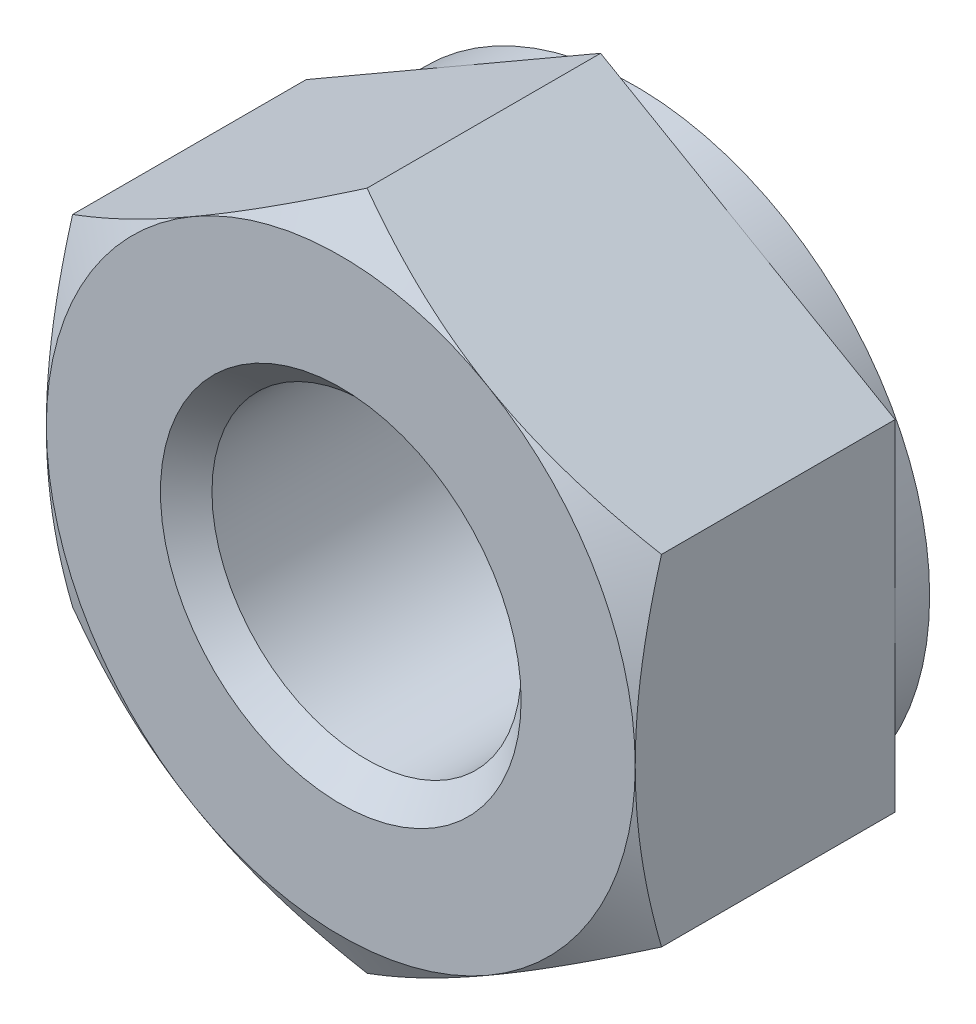
ISO-10303-21;
HEADER;
FILE_DESCRIPTION(('STEP AP214'),'2;1');
FILE_NAME('part.step','',(''),(''),'','','');
FILE_SCHEMA(('AUTOMOTIVE_DESIGN { 1 0 10303 214 1 1 1 1 }'));
ENDSEC;
DATA;
#1=APPLICATION_CONTEXT('core data for automotive mechanical design processes');
#2=APPLICATION_PROTOCOL_DEFINITION('international standard','automotive_design',2000,#1);
#3=PRODUCT_CONTEXT('',#1,'mechanical');
#4=PRODUCT('Part','Part','',(#3));
#5=PRODUCT_RELATED_PRODUCT_CATEGORY('part','',(#4));
#6=PRODUCT_DEFINITION_FORMATION('','',#4);
#7=PRODUCT_DEFINITION_CONTEXT('part definition',#1,'design');
#8=PRODUCT_DEFINITION('design','',#6,#7);
#9=PRODUCT_DEFINITION_SHAPE('','',#8);
#10=(LENGTH_UNIT() NAMED_UNIT(*) SI_UNIT(.MILLI.,.METRE.));
#11=(NAMED_UNIT(*) PLANE_ANGLE_UNIT() SI_UNIT($,.RADIAN.));
#12=(NAMED_UNIT(*) SI_UNIT($,.STERADIAN.) SOLID_ANGLE_UNIT());
#13=UNCERTAINTY_MEASURE_WITH_UNIT(LENGTH_MEASURE(1.E-05),#10,'distance_accuracy_value','');
#14=(GEOMETRIC_REPRESENTATION_CONTEXT(3) GLOBAL_UNCERTAINTY_ASSIGNED_CONTEXT((#13)) GLOBAL_UNIT_ASSIGNED_CONTEXT((#10,
#11,#12)) REPRESENTATION_CONTEXT('',''));
#15=CARTESIAN_POINT('',(0.,0.,0.));
#16=DIRECTION('',(0.,0.,1.));
#17=DIRECTION('',(1.,0.,0.));
#18=AXIS2_PLACEMENT_3D('',#15,#16,#17);
#19=CARTESIAN_POINT('',(4.,2.30940107675851,-4.));
#20=DIRECTION('',(0.5,0.866025403784439,0.));
#21=DIRECTION('',(-0.866025403784439,0.5,0.));
#22=AXIS2_PLACEMENT_3D('',#19,#20,#21);
#23=PLANE('',#22);
#24=CARTESIAN_POINT('',(4.0002,2.30928560670467,-0.357332259074764));
#25=CARTESIAN_POINT('',(3.82442084967677,2.41077174646171,-0.298717873648282));
#26=CARTESIAN_POINT('',(3.64712438367362,2.513133908835,-0.245410321462263));
#27=CARTESIAN_POINT('',(3.28946140682429,2.71963072479812,-0.152361670746405));
#28=CARTESIAN_POINT('',(3.10908854102985,2.82376904741904,-0.112653489029705));
#29=CARTESIAN_POINT('',(2.75057818129721,3.03075510011795,-0.0508422152802797));
#30=CARTESIAN_POINT('',(2.57249584706486,3.13357098372492,-0.0283277315228897));
#31=CARTESIAN_POINT('',(2.21549328283349,3.33968651028529,-0.00145062314658281));
#32=CARTESIAN_POINT('',(2.0365743503559,3.44298540411434,0.00293425857305596));
#33=CARTESIAN_POINT('',(1.70225715780327,3.63600352522933,-0.00619007293997111));
#34=CARTESIAN_POINT('',(1.54680884001293,3.72575165335065,-0.0174589539879952));
#35=CARTESIAN_POINT('',(1.23692494436494,3.90466320392054,-0.0531739907981942));
#36=CARTESIAN_POINT('',(1.08249043825587,3.99382600759479,-0.0776323457115339));
#37=CARTESIAN_POINT('',(0.771967672225421,4.17310641015197,-0.13877606491929));
#38=CARTESIAN_POINT('',(0.615918711936896,4.26320131938131,-0.175720603654865));
#39=CARTESIAN_POINT('',(0.30614816459616,4.44204742827551,-0.259570072548028));
#40=CARTESIAN_POINT('',(0.15242260922622,4.53080091904967,-0.30645530221274));
#41=CARTESIAN_POINT('',(-0.000199999999999398,4.61891762357085,-0.357332259074765));
#42=B_SPLINE_CURVE_WITH_KNOTS('',3,(#24,#25,#26,#27,#28,#29,#30,#31,#32,#33,#34,#35,#36,#37,#38,
#39,#40,#41),.UNSPECIFIED.,.F.,.F.,(4,2,2,2,2,2,2,2,4),(0.,0.634047835695965,1.26961969224543,
1.88946157213122,2.50854226669297,3.04757825393385,3.58711366126903,4.13861653143764,
4.68903648037743),.UNSPECIFIED.);
#43=CARTESIAN_POINT('',(4.,2.30940107675851,-0.35726558990816));
#44=VERTEX_POINT('',#43);
#45=CARTESIAN_POINT('',(2.,3.46410161513775,0.));
#46=VERTEX_POINT('',#45);
#47=EDGE_CURVE('E218',#44,#46,#42,.T.);
#48=ORIENTED_EDGE('',*,*,#47,.F.);
#49=DIRECTION('',(0.,0.,1.));
#50=VECTOR('',#49,1.);
#51=CARTESIAN_POINT('',(4.,2.30940107675851,-4.));
#52=LINE('',#51,#50);
#53=CARTESIAN_POINT('',(4.,2.30940107675851,-3.53));
#54=VERTEX_POINT('',#53);
#55=EDGE_CURVE('E148',#54,#44,#52,.T.);
#56=ORIENTED_EDGE('',*,*,#55,.F.);
#57=DIRECTION('',(0.866025403784439,-0.5,0.));
#58=VECTOR('',#57,1.);
#59=CARTESIAN_POINT('',(4.,2.30940107675851,-3.53));
#60=LINE('',#59,#58);
#61=CARTESIAN_POINT('',(2.,3.46410161513775,-3.53));
#62=VERTEX_POINT('',#61);
#63=EDGE_CURVE('E288',#62,#54,#60,.T.);
#64=ORIENTED_EDGE('',*,*,#63,.F.);
#65=CARTESIAN_POINT('',(0.,4.61880215351701,-3.53));
#66=VERTEX_POINT('',#65);
#67=EDGE_CURVE('E140',#66,#62,#60,.T.);
#68=ORIENTED_EDGE('',*,*,#67,.F.);
#69=DIRECTION('',(0.,0.,1.));
#70=VECTOR('',#69,1.);
#71=CARTESIAN_POINT('',(0.,4.61880215351701,-4.));
#72=LINE('',#71,#70);
#73=CARTESIAN_POINT('',(0.,4.61880215351701,-0.35726558990816));
#74=VERTEX_POINT('',#73);
#75=EDGE_CURVE('E135',#66,#74,#72,.T.);
#76=ORIENTED_EDGE('',*,*,#75,.T.);
#77=EDGE_CURVE('E127',#46,#74,#42,.T.);
#78=ORIENTED_EDGE('',*,*,#77,.F.);
#79=EDGE_LOOP('',(#48,#56,#64,#68,#76,#78));
#80=FACE_BOUND('',#79,.T.);
#81=ADVANCED_FACE('F17',(#80),#23,.T.);
#82=CARTESIAN_POINT('',(4.,-2.30940107675851,-4.));
#83=DIRECTION('',(1.,0.,0.));
#84=DIRECTION('',(0.,0.,-1.));
#85=AXIS2_PLACEMENT_3D('',#82,#83,#84);
#86=PLANE('',#85);
#87=CARTESIAN_POINT('',(4.,-6.12487198995892,-1.91410682124061));
#88=CARTESIAN_POINT('',(4.,-5.94924937038676,-1.82923627076688));
#89=CARTESIAN_POINT('',(4.,-5.77321152095285,-1.74520940380738));
#90=CARTESIAN_POINT('',(4.,-5.42008084777954,-1.57932514679715));
#91=CARTESIAN_POINT('',(4.,-5.24298784779927,-1.49746813236722));
#92=CARTESIAN_POINT('',(4.,-4.88656571686333,-1.33597446305855));
#93=CARTESIAN_POINT('',(4.,-4.70722958889361,-1.25635319506303));
#94=CARTESIAN_POINT('',(4.,-4.34708334747262,-1.10053058542029));
#95=CARTESIAN_POINT('',(4.,-4.16627331143536,-1.02432906550801));
#96=CARTESIAN_POINT('',(4.,-3.80064706744977,-0.875350650394354));
#97=CARTESIAN_POINT('',(4.,-3.61580892822769,-0.802627284215838));
#98=CARTESIAN_POINT('',(4.,-3.24395246794968,-0.662876230959414));
#99=CARTESIAN_POINT('',(4.,-3.056933906958,-0.595849177566499));
#100=CARTESIAN_POINT('',(4.,-2.6808031825377,-0.469291748430877));
#101=CARTESIAN_POINT('',(4.,-2.49169643712848,-0.409745434783834));
#102=CARTESIAN_POINT('',(4.,-2.11079454635851,-0.300083356544503));
#103=CARTESIAN_POINT('',(4.,-1.91900027185748,-0.249964609676748));
#104=CARTESIAN_POINT('',(4.,-1.532592326982,-0.161590794954039));
#105=CARTESIAN_POINT('',(4.,-1.33797792031649,-0.123338885956539));
#106=CARTESIAN_POINT('',(4.,-0.946402725872553,-0.0612742359223436));
#107=CARTESIAN_POINT('',(4.,-0.749441936019773,-0.037461507651699));
#108=CARTESIAN_POINT('',(4.,-0.355451989627944,-0.00638181314943651));
#109=CARTESIAN_POINT('',(4.,-0.158431311094013,0.000989900761040686));
#110=CARTESIAN_POINT('',(4.,0.235472085607466,-0.00120406637479602));
#111=CARTESIAN_POINT('',(4.,0.432354826312202,-0.0107653508153504));
#112=CARTESIAN_POINT('',(4.,0.768560635225516,-0.0408787346135905));
#113=CARTESIAN_POINT('',(4.,0.908254618381821,-0.0575092960439102));
#114=CARTESIAN_POINT('',(4.,1.18656349063498,-0.0982134103466933));
#115=CARTESIAN_POINT('',(4.,1.32517820601014,-0.122288137058448));
#116=CARTESIAN_POINT('',(4.,1.73929045452971,-0.204415070950234));
#117=CARTESIAN_POINT('',(4.,2.01284690528724,-0.272348886425159));
#118=CARTESIAN_POINT('',(4.,2.42218253014527,-0.389516359317212));
#119=CARTESIAN_POINT('',(4.,2.56009536361542,-0.431713941811646));
#120=CARTESIAN_POINT('',(4.,2.83448159101408,-0.520284580227774));
#121=CARTESIAN_POINT('',(4.,2.97095590623562,-0.566654756186925));
#122=CARTESIAN_POINT('',(4.,3.24189440516345,-0.662605699180301));
#123=CARTESIAN_POINT('',(4.,3.37636557946843,-0.712166925753517));
#124=CARTESIAN_POINT('',(4.,3.64426461152919,-0.814198353790719));
#125=CARTESIAN_POINT('',(4.,3.77769202239393,-0.866669730963385));
#126=CARTESIAN_POINT('',(4.,3.91063698986691,-0.920309006541804));
#127=B_SPLINE_CURVE_WITH_KNOTS('',3,(#87,#88,#89,#90,#91,#92,#93,#94,#95,#96,#97,#98,#99,#100,
#101,#102,#103,#104,#105,#106,#107,#108,#109,#110,#111,#112,#113,#114,#115,#116,#117,#118,#119,
#120,#121,#122,#123,#124,#125,#126),.UNSPECIFIED.,.F.,.F.,(4,2,2,2,2,2,2,2,2,2,2,2,2,2,2,2,2,2,
2,4),(0.,0.585171792532271,1.17044423059927,1.7590659464599,2.34765694284827,2.94347400997483,
3.53935727210689,4.133948646976,4.7283516139147,5.32291267067844,5.91747425310811,
6.50823685854035,7.09884609659885,7.5206814082552,7.9425832713084,8.78701491359831,
9.21965281897692,9.65199437116301,10.0819024146297,10.5119854255247),.UNSPECIFIED.);
#128=CARTESIAN_POINT('',(4.,-2.30940107675851,-0.35726558990816));
#129=VERTEX_POINT('',#128);
#130=CARTESIAN_POINT('',(4.,0.,0.));
#131=VERTEX_POINT('',#130);
#132=EDGE_CURVE('E247',#129,#131,#127,.T.);
#133=ORIENTED_EDGE('',*,*,#132,.F.);
#134=DIRECTION('',(0.,0.,1.));
#135=VECTOR('',#134,1.);
#136=CARTESIAN_POINT('',(4.,-2.30940107675851,-4.));
#137=LINE('',#136,#135);
#138=CARTESIAN_POINT('',(4.,-2.30940107675851,-3.53));
#139=VERTEX_POINT('',#138);
#140=EDGE_CURVE('E308',#139,#129,#137,.T.);
#141=ORIENTED_EDGE('',*,*,#140,.F.);
#142=DIRECTION('',(0.,-1.,0.));
#143=VECTOR('',#142,1.);
#144=CARTESIAN_POINT('',(4.,-2.30940107675851,-3.53));
#145=LINE('',#144,#143);
#146=CARTESIAN_POINT('',(4.,0.,-3.53));
#147=VERTEX_POINT('',#146);
#148=EDGE_CURVE('E303',#147,#139,#145,.T.);
#149=ORIENTED_EDGE('',*,*,#148,.F.);
#150=EDGE_CURVE('E293',#54,#147,#145,.T.);
#151=ORIENTED_EDGE('',*,*,#150,.F.);
#152=ORIENTED_EDGE('',*,*,#55,.T.);
#153=EDGE_CURVE('E243',#131,#44,#127,.T.);
#154=ORIENTED_EDGE('',*,*,#153,.F.);
#155=EDGE_LOOP('',(#133,#141,#149,#151,#152,#154));
#156=FACE_BOUND('',#155,.T.);
#157=ADVANCED_FACE('F197',(#156),#86,.T.);
#158=CARTESIAN_POINT('',(0.,-4.61880215351701,-4.));
#159=DIRECTION('',(0.5,-0.866025403784439,0.));
#160=DIRECTION('',(0.866025403784439,0.5,0.));
#161=AXIS2_PLACEMENT_3D('',#158,#159,#160);
#162=PLANE('',#161);
#163=CARTESIAN_POINT('',(-0.000200000000000545,-4.61891762357085,-0.357332259074764));
#164=CARTESIAN_POINT('',(0.175579150323227,-4.51743148381381,-0.298717873648283));
#165=CARTESIAN_POINT('',(0.35287561632638,-4.41506932144052,-0.245410321462264));
#166=CARTESIAN_POINT('',(0.710538593175706,-4.2085725054774,-0.152361670746406));
#167=CARTESIAN_POINT('',(0.89091145897015,-4.10443418285647,-0.112653489029706));
#168=CARTESIAN_POINT('',(1.24942181870279,-3.89744813015756,-0.0508422152802812));
#169=CARTESIAN_POINT('',(1.42750415293514,-3.7946322465506,-0.0283277315228914));
#170=CARTESIAN_POINT('',(1.78450671716651,-3.58851671999023,-0.00145062314658352));
#171=CARTESIAN_POINT('',(1.9634256496441,-3.48521782616117,0.0029342585730562));
#172=CARTESIAN_POINT('',(2.29774284219673,-3.29219970504619,-0.00619007293997084));
#173=CARTESIAN_POINT('',(2.45319115998707,-3.20245157692487,-0.0174589539879956));
#174=CARTESIAN_POINT('',(2.76307505563506,-3.02354002635497,-0.053173990798195));
#175=CARTESIAN_POINT('',(2.91750956174413,-2.93437722268073,-0.0776323457115345));
#176=CARTESIAN_POINT('',(3.22803232777458,-2.75509682012354,-0.138776064919291));
#177=CARTESIAN_POINT('',(3.3840812880631,-2.6650019108942,-0.175720603654865));
#178=CARTESIAN_POINT('',(3.69385183540384,-2.48615580200001,-0.259570072548027));
#179=CARTESIAN_POINT('',(3.84757739077378,-2.39740231122585,-0.306455302212739));
#180=CARTESIAN_POINT('',(4.0002,-2.30928560670467,-0.357332259074764));
#181=B_SPLINE_CURVE_WITH_KNOTS('',3,(#163,#164,#165,#166,#167,#168,#169,#170,#171,#172,#173,
#174,#175,#176,#177,#178,#179,#180),.UNSPECIFIED.,.F.,.F.,(4,2,2,2,2,2,2,2,4),(0.,
0.634047835695966,1.26961969224543,1.88946157213122,2.50854226669297,3.04757825393386,
3.58711366126903,4.13861653143764,4.68903648037743),.UNSPECIFIED.);
#182=CARTESIAN_POINT('',(0.,-4.61880215351701,-0.35726558990816));
#183=VERTEX_POINT('',#182);
#184=CARTESIAN_POINT('',(2.,-3.46410161513775,0.));
#185=VERTEX_POINT('',#184);
#186=EDGE_CURVE('E32',#183,#185,#181,.T.);
#187=ORIENTED_EDGE('',*,*,#186,.F.);
#188=DIRECTION('',(0.,0.,1.));
#189=VECTOR('',#188,1.);
#190=CARTESIAN_POINT('',(0.,-4.61880215351701,-4.));
#191=LINE('',#190,#189);
#192=CARTESIAN_POINT('',(0.,-4.61880215351701,-3.53));
#193=VERTEX_POINT('',#192);
#194=EDGE_CURVE('E137',#193,#183,#191,.T.);
#195=ORIENTED_EDGE('',*,*,#194,.F.);
#196=DIRECTION('',(-0.866025403784439,-0.5,0.));
#197=VECTOR('',#196,1.);
#198=CARTESIAN_POINT('',(0.,-4.61880215351701,-3.53));
#199=LINE('',#198,#197);
#200=CARTESIAN_POINT('',(2.,-3.46410161513776,-3.53));
#201=VERTEX_POINT('',#200);
#202=EDGE_CURVE('E319',#201,#193,#199,.T.);
#203=ORIENTED_EDGE('',*,*,#202,.F.);
#204=EDGE_CURVE('E339',#139,#201,#199,.T.);
#205=ORIENTED_EDGE('',*,*,#204,.F.);
#206=ORIENTED_EDGE('',*,*,#140,.T.);
#207=EDGE_CURVE('E248',#185,#129,#181,.T.);
#208=ORIENTED_EDGE('',*,*,#207,.F.);
#209=EDGE_LOOP('',(#187,#195,#203,#205,#206,#208));
#210=FACE_BOUND('',#209,.T.);
#211=ADVANCED_FACE('F204',(#210),#162,.T.);
#212=CARTESIAN_POINT('',(-4.,-2.30940107675851,-4.));
#213=DIRECTION('',(-0.5,-0.866025403784439,0.));
#214=DIRECTION('',(0.866025403784439,-0.5,0.));
#215=AXIS2_PLACEMENT_3D('',#212,#213,#214);
#216=PLANE('',#215);
#217=CARTESIAN_POINT('',(-4.0002,-2.30928560670467,-0.357332259074764));
#218=CARTESIAN_POINT('',(-3.82442084967677,-2.41077174646171,-0.298717873648282));
#219=CARTESIAN_POINT('',(-3.64712438367362,-2.513133908835,-0.245410321462263));
#220=CARTESIAN_POINT('',(-3.2894614068243,-2.71963072479812,-0.152361670746405));
#221=CARTESIAN_POINT('',(-3.10908854102985,-2.82376904741904,-0.112653489029705));
#222=CARTESIAN_POINT('',(-2.75057818129721,-3.03075510011795,-0.0508422152802799));
#223=CARTESIAN_POINT('',(-2.57249584706486,-3.13357098372492,-0.0283277315228898));
#224=CARTESIAN_POINT('',(-2.2154932828335,-3.33968651028528,-0.00145062314658284));
#225=CARTESIAN_POINT('',(-2.0365743503559,-3.44298540411434,0.00293425857305581));
#226=CARTESIAN_POINT('',(-1.70225715780327,-3.63600352522932,-0.00619007293997101));
#227=CARTESIAN_POINT('',(-1.54680884001294,-3.72575165335064,-0.0174589539879949));
#228=CARTESIAN_POINT('',(-1.23692494436495,-3.90466320392054,-0.0531739907981937));
#229=CARTESIAN_POINT('',(-1.08249043825587,-3.99382600759478,-0.0776323457115335));
#230=CARTESIAN_POINT('',(-0.771967672225423,-4.17310641015197,-0.13877606491929));
#231=CARTESIAN_POINT('',(-0.615918711936899,-4.26320131938131,-0.175720603654864));
#232=CARTESIAN_POINT('',(-0.306148164596161,-4.44204742827551,-0.259570072548027));
#233=CARTESIAN_POINT('',(-0.152422609226222,-4.53080091904967,-0.306455302212739));
#234=CARTESIAN_POINT('',(0.000199999999999276,-4.61891762357085,-0.357332259074764));
#235=B_SPLINE_CURVE_WITH_KNOTS('',3,(#217,#218,#219,#220,#221,#222,#223,#224,#225,#226,#227,
#228,#229,#230,#231,#232,#233,#234),.UNSPECIFIED.,.F.,.F.,(4,2,2,2,2,2,2,2,4),(0.,
0.634047835695965,1.26961969224543,1.88946157213122,2.50854226669296,3.04757825393385,
3.58711366126903,4.13861653143764,4.68903648037743),.UNSPECIFIED.);
#236=CARTESIAN_POINT('',(-4.,-2.30940107675851,-0.35726558990816));
#237=VERTEX_POINT('',#236);
#238=CARTESIAN_POINT('',(-2.,-3.46410161513775,0.));
#239=VERTEX_POINT('',#238);
#240=EDGE_CURVE('E40',#237,#239,#235,.T.);
#241=ORIENTED_EDGE('',*,*,#240,.F.);
#242=DIRECTION('',(0.,0.,1.));
#243=VECTOR('',#242,1.);
#244=CARTESIAN_POINT('',(-4.,-2.30940107675851,-4.));
#245=LINE('',#244,#243);
#246=CARTESIAN_POINT('',(-4.,-2.30940107675851,-3.53));
#247=VERTEX_POINT('',#246);
#248=EDGE_CURVE('E134',#247,#237,#245,.T.);
#249=ORIENTED_EDGE('',*,*,#248,.F.);
#250=DIRECTION('',(-0.866025403784439,0.5,0.));
#251=VECTOR('',#250,1.);
#252=CARTESIAN_POINT('',(-4.,-2.30940107675851,-3.53));
#253=LINE('',#252,#251);
#254=CARTESIAN_POINT('',(-2.,-3.46410161513775,-3.53));
#255=VERTEX_POINT('',#254);
#256=EDGE_CURVE('E343',#255,#247,#253,.T.);
#257=ORIENTED_EDGE('',*,*,#256,.F.);
#258=EDGE_CURVE('E316',#193,#255,#253,.T.);
#259=ORIENTED_EDGE('',*,*,#258,.F.);
#260=ORIENTED_EDGE('',*,*,#194,.T.);
#261=EDGE_CURVE('E314',#239,#183,#235,.T.);
#262=ORIENTED_EDGE('',*,*,#261,.F.);
#263=EDGE_LOOP('',(#241,#249,#257,#259,#260,#262));
#264=FACE_BOUND('',#263,.T.);
#265=ADVANCED_FACE('F259',(#264),#216,.T.);
#266=CARTESIAN_POINT('',(-4.,2.30940107675851,-4.));
#267=DIRECTION('',(-1.,0.,0.));
#268=DIRECTION('',(0.,0.,1.));
#269=AXIS2_PLACEMENT_3D('',#266,#267,#268);
#270=PLANE('',#269);
#271=CARTESIAN_POINT('',(-4.,-6.12487198995892,-1.91410682124061));
#272=CARTESIAN_POINT('',(-4.,-5.94924937038676,-1.82923627076688));
#273=CARTESIAN_POINT('',(-4.,-5.77321152095285,-1.74520940380738));
#274=CARTESIAN_POINT('',(-4.,-5.42008084777954,-1.57932514679715));
#275=CARTESIAN_POINT('',(-4.,-5.24298784779927,-1.49746813236722));
#276=CARTESIAN_POINT('',(-4.,-4.88656571686333,-1.33597446305855));
#277=CARTESIAN_POINT('',(-4.,-4.70722958889361,-1.25635319506303));
#278=CARTESIAN_POINT('',(-4.,-4.34708334747262,-1.10053058542029));
#279=CARTESIAN_POINT('',(-4.,-4.16627331143536,-1.02432906550801));
#280=CARTESIAN_POINT('',(-4.,-3.80064706744977,-0.875350650394354));
#281=CARTESIAN_POINT('',(-4.,-3.61580892822769,-0.802627284215838));
#282=CARTESIAN_POINT('',(-4.,-3.24395246794968,-0.662876230959414));
#283=CARTESIAN_POINT('',(-4.,-3.056933906958,-0.595849177566498));
#284=CARTESIAN_POINT('',(-4.,-2.6808031825377,-0.469291748430877));
#285=CARTESIAN_POINT('',(-4.,-2.49169643712848,-0.409745434783834));
#286=CARTESIAN_POINT('',(-4.,-2.11079454635851,-0.300083356544504));
#287=CARTESIAN_POINT('',(-4.,-1.91900027185748,-0.249964609676749));
#288=CARTESIAN_POINT('',(-4.,-1.532592326982,-0.16159079495404));
#289=CARTESIAN_POINT('',(-4.,-1.33797792031649,-0.123338885956539));
#290=CARTESIAN_POINT('',(-4.,-0.946402725872552,-0.0612742359223434));
#291=CARTESIAN_POINT('',(-4.,-0.749441936019772,-0.037461507651699));
#292=CARTESIAN_POINT('',(-4.,-0.355451989627941,-0.00638181314943648));
#293=CARTESIAN_POINT('',(-4.,-0.15843131109401,0.000989900761041092));
#294=CARTESIAN_POINT('',(-4.,0.235472085607469,-0.00120406637479643));
#295=CARTESIAN_POINT('',(-4.,0.432354826312205,-0.010765350815352));
#296=CARTESIAN_POINT('',(-4.,0.768560635225519,-0.0408787346135919));
#297=CARTESIAN_POINT('',(-4.,0.908254618381824,-0.057509296043911));
#298=CARTESIAN_POINT('',(-4.,1.18656349063498,-0.0982134103466937));
#299=CARTESIAN_POINT('',(-4.,1.32517820601015,-0.122288137058449));
#300=CARTESIAN_POINT('',(-4.,1.73929045452971,-0.204415070950236));
#301=CARTESIAN_POINT('',(-4.,2.01284690528725,-0.27234888642516));
#302=CARTESIAN_POINT('',(-4.,2.42218253014527,-0.389516359317213));
#303=CARTESIAN_POINT('',(-4.,2.56009536361542,-0.431713941811647));
#304=CARTESIAN_POINT('',(-4.,2.83448159101408,-0.520284580227775));
#305=CARTESIAN_POINT('',(-4.,2.97095590623562,-0.566654756186926));
#306=CARTESIAN_POINT('',(-4.,3.24189440516346,-0.662605699180303));
#307=CARTESIAN_POINT('',(-4.,3.37636557946844,-0.712166925753518));
#308=CARTESIAN_POINT('',(-4.,3.6442646115292,-0.814198353790721));
#309=CARTESIAN_POINT('',(-4.,3.77769202239393,-0.866669730963388));
#310=CARTESIAN_POINT('',(-4.,3.91063698986691,-0.920309006541808));
#311=B_SPLINE_CURVE_WITH_KNOTS('',3,(#271,#272,#273,#274,#275,#276,#277,#278,#279,#280,#281,
#282,#283,#284,#285,#286,#287,#288,#289,#290,#291,#292,#293,#294,#295,#296,#297,#298,#299,#300,
#301,#302,#303,#304,#305,#306,#307,#308,#309,#310),.UNSPECIFIED.,.F.,.F.,(4,2,2,2,2,2,2,2,2,2,2,
2,2,2,2,2,2,2,2,4),(0.,0.58517179253227,1.17044423059927,1.7590659464599,2.34765694284827,
2.94347400997483,3.53935727210689,4.133948646976,4.7283516139147,5.32291267067844,
5.91747425310812,6.50823685854035,7.09884609659885,7.52068140825521,7.9425832713084,
8.78701491359832,9.21965281897692,9.65199437116301,10.0819024146297,10.5119854255247),.UNSPECIFIED.);
#312=CARTESIAN_POINT('',(-4.,2.30940107675851,-0.35726558990816));
#313=VERTEX_POINT('',#312);
#314=CARTESIAN_POINT('',(-4.,0.,0.));
#315=VERTEX_POINT('',#314);
#316=EDGE_CURVE('E110',#313,#315,#311,.F.);
#317=ORIENTED_EDGE('',*,*,#316,.F.);
#318=DIRECTION('',(0.,0.,1.));
#319=VECTOR('',#318,1.);
#320=CARTESIAN_POINT('',(-4.,2.30940107675851,-4.));
#321=LINE('',#320,#319);
#322=CARTESIAN_POINT('',(-4.,2.30940107675851,-3.53));
#323=VERTEX_POINT('',#322);
#324=EDGE_CURVE('E124',#323,#313,#321,.T.);
#325=ORIENTED_EDGE('',*,*,#324,.F.);
#326=DIRECTION('',(0.,1.,0.));
#327=VECTOR('',#326,1.);
#328=CARTESIAN_POINT('',(-4.,2.30940107675851,-3.53));
#329=LINE('',#328,#327);
#330=CARTESIAN_POINT('',(-4.,0.,-3.53));
#331=VERTEX_POINT('',#330);
#332=EDGE_CURVE('E346',#331,#323,#329,.T.);
#333=ORIENTED_EDGE('',*,*,#332,.F.);
#334=EDGE_CURVE('E345',#247,#331,#329,.T.);
#335=ORIENTED_EDGE('',*,*,#334,.F.);
#336=ORIENTED_EDGE('',*,*,#248,.T.);
#337=EDGE_CURVE('E126',#315,#237,#311,.F.);
#338=ORIENTED_EDGE('',*,*,#337,.F.);
#339=EDGE_LOOP('',(#317,#325,#333,#335,#336,#338));
#340=FACE_BOUND('',#339,.T.);
#341=ADVANCED_FACE('F122',(#340),#270,.T.);
#342=CARTESIAN_POINT('',(0.,4.61880215351701,-4.));
#343=DIRECTION('',(-0.5,0.866025403784439,0.));
#344=DIRECTION('',(-0.866025403784439,-0.5,0.));
#345=AXIS2_PLACEMENT_3D('',#342,#343,#344);
#346=PLANE('',#345);
#347=CARTESIAN_POINT('',(0.000199999999999985,4.61891762357085,-0.357332259074765));
#348=CARTESIAN_POINT('',(-0.175579150323228,4.51743148381381,-0.298717873648283));
#349=CARTESIAN_POINT('',(-0.35287561632638,4.41506932144052,-0.245410321462264));
#350=CARTESIAN_POINT('',(-0.710538593175706,4.2085725054774,-0.152361670746406));
#351=CARTESIAN_POINT('',(-0.890911458970151,4.10443418285647,-0.112653489029706));
#352=CARTESIAN_POINT('',(-1.24942181870279,3.89744813015756,-0.0508422152802813));
#353=CARTESIAN_POINT('',(-1.42750415293514,3.7946322465506,-0.0283277315228912));
#354=CARTESIAN_POINT('',(-1.78450671716651,3.58851671999023,-0.00145062314658365));
#355=CARTESIAN_POINT('',(-1.9634256496441,3.48521782616117,0.0029342585730557));
#356=CARTESIAN_POINT('',(-2.29774284219673,3.29219970504619,-0.00619007293997134));
#357=CARTESIAN_POINT('',(-2.45319115998707,3.20245157692487,-0.0174589539879959));
#358=CARTESIAN_POINT('',(-2.76307505563506,3.02354002635497,-0.053173990798195));
#359=CARTESIAN_POINT('',(-2.91750956174413,2.93437722268073,-0.0776323457115345));
#360=CARTESIAN_POINT('',(-3.22803232777458,2.75509682012354,-0.138776064919291));
#361=CARTESIAN_POINT('',(-3.3840812880631,2.6650019108942,-0.175720603654865));
#362=CARTESIAN_POINT('',(-3.69385183540384,2.48615580200001,-0.259570072548028));
#363=CARTESIAN_POINT('',(-3.84757739077378,2.39740231122585,-0.30645530221274));
#364=CARTESIAN_POINT('',(-4.0002,2.30928560670467,-0.357332259074765));
#365=B_SPLINE_CURVE_WITH_KNOTS('',3,(#347,#348,#349,#350,#351,#352,#353,#354,#355,#356,#357,
#358,#359,#360,#361,#362,#363,#364),.UNSPECIFIED.,.F.,.F.,(4,2,2,2,2,2,2,2,4),(0.,
0.634047835695966,1.26961969224543,1.88946157213122,2.50854226669297,3.04757825393386,
3.58711366126903,4.13861653143764,4.68903648037743),.UNSPECIFIED.);
#366=CARTESIAN_POINT('',(-2.,3.46410161513775,0.));
#367=VERTEX_POINT('',#366);
#368=EDGE_CURVE('E117',#74,#367,#365,.T.);
#369=ORIENTED_EDGE('',*,*,#368,.F.);
#370=ORIENTED_EDGE('',*,*,#75,.F.);
#371=DIRECTION('',(0.866025403784439,0.5,0.));
#372=VECTOR('',#371,1.);
#373=CARTESIAN_POINT('',(0.,4.61880215351701,-3.53));
#374=LINE('',#373,#372);
#375=CARTESIAN_POINT('',(-2.,3.46410161513776,-3.53));
#376=VERTEX_POINT('',#375);
#377=EDGE_CURVE('E147',#376,#66,#374,.T.);
#378=ORIENTED_EDGE('',*,*,#377,.F.);
#379=EDGE_CURVE('E133',#323,#376,#374,.T.);
#380=ORIENTED_EDGE('',*,*,#379,.F.);
#381=ORIENTED_EDGE('',*,*,#324,.T.);
#382=EDGE_CURVE('E107',#367,#313,#365,.T.);
#383=ORIENTED_EDGE('',*,*,#382,.F.);
#384=EDGE_LOOP('',(#369,#370,#378,#380,#381,#383));
#385=FACE_BOUND('',#384,.T.);
#386=ADVANCED_FACE('F130',(#385),#346,.T.);
#387=CARTESIAN_POINT('',(0.,7.61880215351701,-3.53));
#388=DIRECTION('',(0.,0.,1.));
#389=DIRECTION('',(1.,0.,0.));
#390=AXIS2_PLACEMENT_3D('',#387,#388,#389);
#391=PLANE('',#390);
#392=ORIENTED_EDGE('',*,*,#67,.T.);
#393=CARTESIAN_POINT('',(0.,0.,-3.53));
#394=DIRECTION('',(0.,0.,-1.));
#395=DIRECTION('',(-1.,0.,0.));
#396=AXIS2_PLACEMENT_3D('',#393,#394,#395);
#397=CIRCLE('',#396,4.);
#398=EDGE_CURVE('E285',#376,#62,#397,.T.);
#399=ORIENTED_EDGE('',*,*,#398,.F.);
#400=ORIENTED_EDGE('',*,*,#377,.T.);
#401=EDGE_LOOP('',(#392,#399,#400));
#402=FACE_BOUND('',#401,.T.);
#403=ADVANCED_FACE('F192',(#402),#391,.F.);
#404=ORIENTED_EDGE('',*,*,#63,.T.);
#405=ORIENTED_EDGE('',*,*,#150,.T.);
#406=EDGE_CURVE('E291',#62,#147,#397,.T.);
#407=ORIENTED_EDGE('',*,*,#406,.F.);
#408=EDGE_LOOP('',(#404,#405,#407));
#409=FACE_BOUND('',#408,.T.);
#410=ADVANCED_FACE('F274',(#409),#391,.F.);
#411=ORIENTED_EDGE('',*,*,#148,.T.);
#412=ORIENTED_EDGE('',*,*,#204,.T.);
#413=EDGE_CURVE('E297',#147,#201,#397,.T.);
#414=ORIENTED_EDGE('',*,*,#413,.F.);
#415=EDGE_LOOP('',(#411,#412,#414));
#416=FACE_BOUND('',#415,.T.);
#417=ADVANCED_FACE('F280',(#416),#391,.F.);
#418=ORIENTED_EDGE('',*,*,#202,.T.);
#419=ORIENTED_EDGE('',*,*,#258,.T.);
#420=EDGE_CURVE('E322',#201,#255,#397,.T.);
#421=ORIENTED_EDGE('',*,*,#420,.F.);
#422=EDGE_LOOP('',(#418,#419,#421));
#423=FACE_BOUND('',#422,.T.);
#424=ADVANCED_FACE('F193',(#423),#391,.F.);
#425=ORIENTED_EDGE('',*,*,#256,.T.);
#426=ORIENTED_EDGE('',*,*,#334,.T.);
#427=EDGE_CURVE('E321',#255,#331,#397,.T.);
#428=ORIENTED_EDGE('',*,*,#427,.F.);
#429=EDGE_LOOP('',(#425,#426,#428));
#430=FACE_BOUND('',#429,.T.);
#431=ADVANCED_FACE('F181',(#430),#391,.F.);
#432=CARTESIAN_POINT('',(0.,0.,0.));
#433=DIRECTION('',(0.,0.,-1.));
#434=DIRECTION('',(-1.,0.,0.));
#435=AXIS2_PLACEMENT_3D('',#432,#433,#434);
#436=CYLINDRICAL_SURFACE('',#435,4.);
#437=ORIENTED_EDGE('',*,*,#398,.T.);
#438=ORIENTED_EDGE('',*,*,#406,.T.);
#439=ORIENTED_EDGE('',*,*,#413,.T.);
#440=ORIENTED_EDGE('',*,*,#420,.T.);
#441=ORIENTED_EDGE('',*,*,#427,.T.);
#442=EDGE_CURVE('E300',#331,#376,#397,.T.);
#443=ORIENTED_EDGE('',*,*,#442,.T.);
#444=EDGE_LOOP('',(#437,#438,#439,#440,#441,#443));
#445=FACE_BOUND('',#444,.T.);
#446=CARTESIAN_POINT('',(0.,0.,-4.));
#447=DIRECTION('',(0.,0.,1.));
#448=DIRECTION('',(1.,0.,0.));
#449=AXIS2_PLACEMENT_3D('',#446,#447,#448);
#450=CIRCLE('',#449,4.);
#451=CARTESIAN_POINT('',(4.,0.,-4.));
#452=VERTEX_POINT('',#451);
#453=EDGE_CURVE('E144',#452,#452,#450,.F.);
#454=ORIENTED_EDGE('',*,*,#453,.F.);
#455=EDGE_LOOP('',(#454));
#456=FACE_BOUND('',#455,.T.);
#457=ADVANCED_FACE('F179',(#445,#456),#436,.T.);
#458=ORIENTED_EDGE('',*,*,#332,.T.);
#459=ORIENTED_EDGE('',*,*,#379,.T.);
#460=ORIENTED_EDGE('',*,*,#442,.F.);
#461=EDGE_LOOP('',(#458,#459,#460));
#462=FACE_BOUND('',#461,.T.);
#463=ADVANCED_FACE('F175',(#462),#391,.F.);
#464=CARTESIAN_POINT('',(0.,4.61880215351701,-4.));
#465=DIRECTION('',(0.,0.,1.));
#466=DIRECTION('',(1.,0.,0.));
#467=AXIS2_PLACEMENT_3D('',#464,#465,#466);
#468=PLANE('',#467);
#469=CARTESIAN_POINT('',(0.,0.,-4.));
#470=DIRECTION('',(0.,0.,1.));
#471=DIRECTION('',(1.,0.,0.));
#472=AXIS2_PLACEMENT_3D('',#469,#470,#471);
#473=CIRCLE('',#472,2.45);
#474=CARTESIAN_POINT('',(2.45,0.,-4.));
#475=VERTEX_POINT('',#474);
#476=EDGE_CURVE('E155',#475,#475,#473,.T.);
#477=ORIENTED_EDGE('',*,*,#476,.T.);
#478=EDGE_LOOP('',(#477));
#479=FACE_BOUND('',#478,.T.);
#480=ORIENTED_EDGE('',*,*,#453,.T.);
#481=EDGE_LOOP('',(#480));
#482=FACE_BOUND('',#481,.T.);
#483=ADVANCED_FACE('F171',(#479,#482),#468,.F.);
#484=CARTESIAN_POINT('',(0.,0.,0.));
#485=DIRECTION('',(0.,0.,-1.));
#486=DIRECTION('',(-1.,0.,0.));
#487=AXIS2_PLACEMENT_3D('',#484,#485,#486);
#488=CONICAL_SURFACE('',#487,4.,1.0471975511966);
#489=ORIENTED_EDGE('',*,*,#153,.T.);
#490=ORIENTED_EDGE('',*,*,#47,.T.);
#491=CARTESIAN_POINT('',(0.,0.,0.));
#492=DIRECTION('',(0.,0.,1.));
#493=DIRECTION('',(1.,0.,0.));
#494=AXIS2_PLACEMENT_3D('',#491,#492,#493);
#495=CIRCLE('',#494,4.);
#496=EDGE_CURVE('E150',#46,#131,#495,.F.);
#497=ORIENTED_EDGE('',*,*,#496,.T.);
#498=EDGE_LOOP('',(#489,#490,#497));
#499=FACE_BOUND('',#498,.T.);
#500=ADVANCED_FACE('F174',(#499),#488,.T.);
#501=ORIENTED_EDGE('',*,*,#77,.T.);
#502=ORIENTED_EDGE('',*,*,#368,.T.);
#503=EDGE_CURVE('E153',#367,#46,#495,.F.);
#504=ORIENTED_EDGE('',*,*,#503,.T.);
#505=EDGE_LOOP('',(#501,#502,#504));
#506=FACE_BOUND('',#505,.T.);
#507=ADVANCED_FACE('F231',(#506),#488,.T.);
#508=ORIENTED_EDGE('',*,*,#316,.T.);
#509=CARTESIAN_POINT('',(0.,0.,0.));
#510=DIRECTION('',(0.,0.,-1.));
#511=DIRECTION('',(-1.,0.,0.));
#512=AXIS2_PLACEMENT_3D('',#509,#510,#511);
#513=CIRCLE('',#512,4.);
#514=EDGE_CURVE('E112',#315,#367,#513,.T.);
#515=ORIENTED_EDGE('',*,*,#514,.T.);
#516=ORIENTED_EDGE('',*,*,#382,.T.);
#517=EDGE_LOOP('',(#508,#515,#516));
#518=FACE_BOUND('',#517,.T.);
#519=ADVANCED_FACE('F109',(#518),#488,.T.);
#520=ORIENTED_EDGE('',*,*,#240,.T.);
#521=EDGE_CURVE('E334',#239,#315,#495,.F.);
#522=ORIENTED_EDGE('',*,*,#521,.T.);
#523=ORIENTED_EDGE('',*,*,#337,.T.);
#524=EDGE_LOOP('',(#520,#522,#523));
#525=FACE_BOUND('',#524,.T.);
#526=ADVANCED_FACE('F230',(#525),#488,.T.);
#527=ORIENTED_EDGE('',*,*,#186,.T.);
#528=EDGE_CURVE('E335',#185,#239,#495,.F.);
#529=ORIENTED_EDGE('',*,*,#528,.T.);
#530=ORIENTED_EDGE('',*,*,#261,.T.);
#531=EDGE_LOOP('',(#527,#529,#530));
#532=FACE_BOUND('',#531,.T.);
#533=ADVANCED_FACE('F232',(#532),#488,.T.);
#534=ORIENTED_EDGE('',*,*,#207,.T.);
#535=ORIENTED_EDGE('',*,*,#132,.T.);
#536=EDGE_CURVE('E154',#131,#185,#495,.F.);
#537=ORIENTED_EDGE('',*,*,#536,.T.);
#538=EDGE_LOOP('',(#534,#535,#537));
#539=FACE_BOUND('',#538,.T.);
#540=ADVANCED_FACE('F337',(#539),#488,.T.);
#541=CARTESIAN_POINT('',(0.,4.61880215351701,0.));
#542=DIRECTION('',(0.,0.,1.));
#543=DIRECTION('',(1.,0.,0.));
#544=AXIS2_PLACEMENT_3D('',#541,#542,#543);
#545=PLANE('',#544);
#546=CARTESIAN_POINT('',(0.,0.,0.));
#547=DIRECTION('',(0.,0.,1.));
#548=DIRECTION('',(1.,0.,0.));
#549=AXIS2_PLACEMENT_3D('',#546,#547,#548);
#550=CIRCLE('',#549,2.45);
#551=CARTESIAN_POINT('',(2.45,0.,0.));
#552=VERTEX_POINT('',#551);
#553=EDGE_CURVE('E11',#552,#552,#550,.F.);
#554=ORIENTED_EDGE('',*,*,#553,.T.);
#555=EDGE_LOOP('',(#554));
#556=FACE_BOUND('',#555,.T.);
#557=ORIENTED_EDGE('',*,*,#536,.F.);
#558=ORIENTED_EDGE('',*,*,#496,.F.);
#559=ORIENTED_EDGE('',*,*,#503,.F.);
#560=ORIENTED_EDGE('',*,*,#514,.F.);
#561=ORIENTED_EDGE('',*,*,#521,.F.);
#562=ORIENTED_EDGE('',*,*,#528,.F.);
#563=EDGE_LOOP('',(#557,#558,#559,#560,#561,#562));
#564=FACE_BOUND('',#563,.T.);
#565=ADVANCED_FACE('F256',(#556,#564),#545,.T.);
#566=CARTESIAN_POINT('',(0.,0.,0.));
#567=DIRECTION('',(0.,0.,1.));
#568=DIRECTION('',(1.,0.,0.));
#569=AXIS2_PLACEMENT_3D('',#566,#567,#568);
#570=CYLINDRICAL_SURFACE('',#569,2.1);
#571=CARTESIAN_POINT('',(0.,0.,-3.65));
#572=DIRECTION('',(0.,0.,1.));
#573=DIRECTION('',(1.,0.,0.));
#574=AXIS2_PLACEMENT_3D('',#571,#572,#573);
#575=CIRCLE('',#574,2.1);
#576=CARTESIAN_POINT('',(2.1,0.,-3.65));
#577=VERTEX_POINT('',#576);
#578=EDGE_CURVE('E25',#577,#577,#575,.F.);
#579=ORIENTED_EDGE('',*,*,#578,.T.);
#580=EDGE_LOOP('',(#579));
#581=FACE_BOUND('',#580,.T.);
#582=CARTESIAN_POINT('',(0.,0.,-0.35));
#583=DIRECTION('',(0.,0.,1.));
#584=DIRECTION('',(1.,0.,0.));
#585=AXIS2_PLACEMENT_3D('',#582,#583,#584);
#586=CIRCLE('',#585,2.1);
#587=CARTESIAN_POINT('',(2.1,0.,-0.35));
#588=VERTEX_POINT('',#587);
#589=EDGE_CURVE('E158',#588,#588,#586,.T.);
#590=ORIENTED_EDGE('',*,*,#589,.T.);
#591=EDGE_LOOP('',(#590));
#592=FACE_BOUND('',#591,.T.);
#593=ADVANCED_FACE('F163',(#581,#592),#570,.F.);
#594=CARTESIAN_POINT('',(0.,0.,-4.));
#595=DIRECTION('',(0.,0.,-1.));
#596=DIRECTION('',(-1.,0.,0.));
#597=AXIS2_PLACEMENT_3D('',#594,#595,#596);
#598=CONICAL_SURFACE('',#597,2.45,0.785398163397447);
#599=ORIENTED_EDGE('',*,*,#578,.F.);
#600=EDGE_LOOP('',(#599));
#601=FACE_BOUND('',#600,.T.);
#602=ORIENTED_EDGE('',*,*,#476,.F.);
#603=EDGE_LOOP('',(#602));
#604=FACE_BOUND('',#603,.T.);
#605=ADVANCED_FACE('F166',(#601,#604),#598,.F.);
#606=CARTESIAN_POINT('',(0.,0.,-0.35));
#607=DIRECTION('',(0.,0.,1.));
#608=DIRECTION('',(1.,0.,0.));
#609=AXIS2_PLACEMENT_3D('',#606,#607,#608);
#610=CONICAL_SURFACE('',#609,2.1,0.78539816339745);
#611=ORIENTED_EDGE('',*,*,#553,.F.);
#612=EDGE_LOOP('',(#611));
#613=FACE_BOUND('',#612,.T.);
#614=ORIENTED_EDGE('',*,*,#589,.F.);
#615=EDGE_LOOP('',(#614));
#616=FACE_BOUND('',#615,.T.);
#617=ADVANCED_FACE('F19',(#613,#616),#610,.F.);
#618=CLOSED_SHELL('',(#81,#157,#211,#265,#341,#386,#403,#410,#417,#424,#431,#457,#463,#483,#500,
#507,#519,#526,#533,#540,#565,#593,#605,#617));
#619=MANIFOLD_SOLID_BREP('B1',#618);
#620=ADVANCED_BREP_SHAPE_REPRESENTATION('',(#18,#619),#14);
#621=SHAPE_DEFINITION_REPRESENTATION(#9,#620);
ENDSEC;
END-ISO-10303-21;
